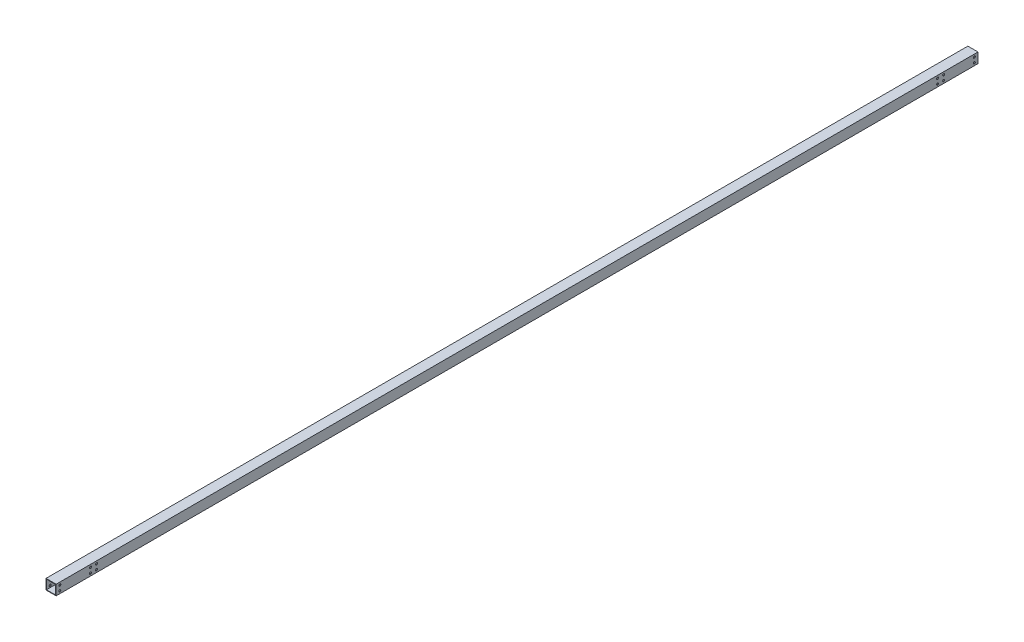
ISO-10303-21;
HEADER;
FILE_DESCRIPTION(('STEP AP214'),'2;1');
FILE_NAME('part.step','',(''),(''),'','','');
FILE_SCHEMA(('AUTOMOTIVE_DESIGN { 1 0 10303 214 1 1 1 1 }'));
ENDSEC;
DATA;
#1=APPLICATION_CONTEXT('core data for automotive mechanical design processes');
#2=APPLICATION_PROTOCOL_DEFINITION('international standard','automotive_design',2000,#1);
#3=PRODUCT_CONTEXT('',#1,'mechanical');
#4=PRODUCT('Part','Part','',(#3));
#5=PRODUCT_RELATED_PRODUCT_CATEGORY('part','',(#4));
#6=PRODUCT_DEFINITION_FORMATION('','',#4);
#7=PRODUCT_DEFINITION_CONTEXT('part definition',#1,'design');
#8=PRODUCT_DEFINITION('design','',#6,#7);
#9=PRODUCT_DEFINITION_SHAPE('','',#8);
#10=(LENGTH_UNIT() NAMED_UNIT(*) SI_UNIT(.MILLI.,.METRE.));
#11=(NAMED_UNIT(*) PLANE_ANGLE_UNIT() SI_UNIT($,.RADIAN.));
#12=(NAMED_UNIT(*) SI_UNIT($,.STERADIAN.) SOLID_ANGLE_UNIT());
#13=UNCERTAINTY_MEASURE_WITH_UNIT(LENGTH_MEASURE(1.E-05),#10,'distance_accuracy_value','');
#14=(GEOMETRIC_REPRESENTATION_CONTEXT(3) GLOBAL_UNCERTAINTY_ASSIGNED_CONTEXT((#13)) GLOBAL_UNIT_ASSIGNED_CONTEXT((#10,
#11,#12)) REPRESENTATION_CONTEXT('',''));
#15=CARTESIAN_POINT('',(0.,0.,0.));
#16=DIRECTION('',(0.,0.,1.));
#17=DIRECTION('',(1.,0.,0.));
#18=AXIS2_PLACEMENT_3D('',#15,#16,#17);
#19=CARTESIAN_POINT('',(0.,0.,1820.));
#20=DIRECTION('',(0.,0.,-1.));
#21=DIRECTION('',(-1.,0.,0.));
#22=AXIS2_PLACEMENT_3D('',#19,#20,#21);
#23=PLANE('',#22);
#24=DIRECTION('',(0.,-1.,0.));
#25=VECTOR('',#24,1.);
#26=CARTESIAN_POINT('',(0.,0.,1820.));
#27=LINE('',#26,#25);
#28=CARTESIAN_POINT('',(0.,20.,1820.));
#29=VERTEX_POINT('',#28);
#30=CARTESIAN_POINT('',(0.,0.,1820.));
#31=VERTEX_POINT('',#30);
#32=EDGE_CURVE('E159',#29,#31,#27,.T.);
#33=ORIENTED_EDGE('',*,*,#32,.T.);
#34=DIRECTION('',(1.,0.,0.));
#35=VECTOR('',#34,1.);
#36=CARTESIAN_POINT('',(0.,0.,1820.));
#37=LINE('',#36,#35);
#38=CARTESIAN_POINT('',(20.,0.,1820.));
#39=VERTEX_POINT('',#38);
#40=EDGE_CURVE('E163',#31,#39,#37,.T.);
#41=ORIENTED_EDGE('',*,*,#40,.T.);
#42=DIRECTION('',(0.,1.,0.));
#43=VECTOR('',#42,1.);
#44=CARTESIAN_POINT('',(20.,0.,1820.));
#45=LINE('',#44,#43);
#46=CARTESIAN_POINT('',(20.,20.,1820.));
#47=VERTEX_POINT('',#46);
#48=EDGE_CURVE('E167',#39,#47,#45,.T.);
#49=ORIENTED_EDGE('',*,*,#48,.T.);
#50=DIRECTION('',(-1.,0.,0.));
#51=VECTOR('',#50,1.);
#52=CARTESIAN_POINT('',(0.,20.,1820.));
#53=LINE('',#52,#51);
#54=EDGE_CURVE('E170',#47,#29,#53,.T.);
#55=ORIENTED_EDGE('',*,*,#54,.T.);
#56=EDGE_LOOP('',(#33,#41,#49,#55));
#57=FACE_BOUND('',#56,.T.);
#58=DIRECTION('',(0.,-1.,0.));
#59=VECTOR('',#58,1.);
#60=CARTESIAN_POINT('',(1.,1.,1820.));
#61=LINE('',#60,#59);
#62=CARTESIAN_POINT('',(1.,19.,1820.));
#63=VERTEX_POINT('',#62);
#64=CARTESIAN_POINT('',(1.,1.,1820.));
#65=VERTEX_POINT('',#64);
#66=EDGE_CURVE('E107',#63,#65,#61,.T.);
#67=ORIENTED_EDGE('',*,*,#66,.F.);
#68=DIRECTION('',(-1.,0.,0.));
#69=VECTOR('',#68,1.);
#70=CARTESIAN_POINT('',(1.,19.,1820.));
#71=LINE('',#70,#69);
#72=CARTESIAN_POINT('',(19.,19.,1820.));
#73=VERTEX_POINT('',#72);
#74=EDGE_CURVE('E135',#73,#63,#71,.T.);
#75=ORIENTED_EDGE('',*,*,#74,.F.);
#76=DIRECTION('',(0.,1.,0.));
#77=VECTOR('',#76,1.);
#78=CARTESIAN_POINT('',(19.,1.,1820.));
#79=LINE('',#78,#77);
#80=CARTESIAN_POINT('',(19.,1.,1820.));
#81=VERTEX_POINT('',#80);
#82=EDGE_CURVE('E129',#81,#73,#79,.T.);
#83=ORIENTED_EDGE('',*,*,#82,.F.);
#84=DIRECTION('',(1.,0.,0.));
#85=VECTOR('',#84,1.);
#86=CARTESIAN_POINT('',(1.,1.,1820.));
#87=LINE('',#86,#85);
#88=EDGE_CURVE('E116',#65,#81,#87,.T.);
#89=ORIENTED_EDGE('',*,*,#88,.F.);
#90=EDGE_LOOP('',(#67,#75,#83,#89));
#91=FACE_BOUND('',#90,.T.);
#92=ADVANCED_FACE('F39',(#57,#91),#23,.F.);
#93=CARTESIAN_POINT('',(0.,0.,0.));
#94=DIRECTION('',(0.,0.,-1.));
#95=DIRECTION('',(-1.,0.,0.));
#96=AXIS2_PLACEMENT_3D('',#93,#94,#95);
#97=PLANE('',#96);
#98=DIRECTION('',(0.,-1.,0.));
#99=VECTOR('',#98,1.);
#100=CARTESIAN_POINT('',(0.,0.,0.));
#101=LINE('',#100,#99);
#102=CARTESIAN_POINT('',(0.,20.,0.));
#103=VERTEX_POINT('',#102);
#104=CARTESIAN_POINT('',(0.,0.,0.));
#105=VERTEX_POINT('',#104);
#106=EDGE_CURVE('E125',#103,#105,#101,.T.);
#107=ORIENTED_EDGE('',*,*,#106,.F.);
#108=DIRECTION('',(-1.,0.,0.));
#109=VECTOR('',#108,1.);
#110=CARTESIAN_POINT('',(0.,20.,0.));
#111=LINE('',#110,#109);
#112=CARTESIAN_POINT('',(20.,20.,0.));
#113=VERTEX_POINT('',#112);
#114=EDGE_CURVE('E164',#113,#103,#111,.T.);
#115=ORIENTED_EDGE('',*,*,#114,.F.);
#116=DIRECTION('',(0.,1.,0.));
#117=VECTOR('',#116,1.);
#118=CARTESIAN_POINT('',(20.,0.,0.));
#119=LINE('',#118,#117);
#120=CARTESIAN_POINT('',(20.,0.,0.));
#121=VERTEX_POINT('',#120);
#122=EDGE_CURVE('E180',#121,#113,#119,.T.);
#123=ORIENTED_EDGE('',*,*,#122,.F.);
#124=DIRECTION('',(1.,0.,0.));
#125=VECTOR('',#124,1.);
#126=CARTESIAN_POINT('',(0.,0.,0.));
#127=LINE('',#126,#125);
#128=EDGE_CURVE('E177',#105,#121,#127,.T.);
#129=ORIENTED_EDGE('',*,*,#128,.F.);
#130=EDGE_LOOP('',(#107,#115,#123,#129));
#131=FACE_BOUND('',#130,.T.);
#132=DIRECTION('',(-1.,0.,0.));
#133=VECTOR('',#132,1.);
#134=CARTESIAN_POINT('',(1.,19.,0.));
#135=LINE('',#134,#133);
#136=CARTESIAN_POINT('',(19.,19.,0.));
#137=VERTEX_POINT('',#136);
#138=CARTESIAN_POINT('',(1.,19.,0.));
#139=VERTEX_POINT('',#138);
#140=EDGE_CURVE('E117',#137,#139,#135,.T.);
#141=ORIENTED_EDGE('',*,*,#140,.T.);
#142=DIRECTION('',(0.,-1.,0.));
#143=VECTOR('',#142,1.);
#144=CARTESIAN_POINT('',(1.,1.,0.));
#145=LINE('',#144,#143);
#146=CARTESIAN_POINT('',(1.,1.,0.));
#147=VERTEX_POINT('',#146);
#148=EDGE_CURVE('E65',#139,#147,#145,.T.);
#149=ORIENTED_EDGE('',*,*,#148,.T.);
#150=DIRECTION('',(1.,0.,0.));
#151=VECTOR('',#150,1.);
#152=CARTESIAN_POINT('',(1.,1.,0.));
#153=LINE('',#152,#151);
#154=CARTESIAN_POINT('',(19.,1.,0.));
#155=VERTEX_POINT('',#154);
#156=EDGE_CURVE('E123',#147,#155,#153,.T.);
#157=ORIENTED_EDGE('',*,*,#156,.T.);
#158=DIRECTION('',(0.,1.,0.));
#159=VECTOR('',#158,1.);
#160=CARTESIAN_POINT('',(19.,1.,0.));
#161=LINE('',#160,#159);
#162=EDGE_CURVE('E146',#155,#137,#161,.T.);
#163=ORIENTED_EDGE('',*,*,#162,.T.);
#164=EDGE_LOOP('',(#141,#149,#157,#163));
#165=FACE_BOUND('',#164,.T.);
#166=ADVANCED_FACE('F303',(#131,#165),#97,.T.);
#167=CARTESIAN_POINT('',(0.,0.,1820.));
#168=DIRECTION('',(1.,0.,0.));
#169=DIRECTION('',(0.,0.,-1.));
#170=AXIS2_PLACEMENT_3D('',#167,#168,#169);
#171=PLANE('',#170);
#172=CARTESIAN_POINT('',(0.,15.0000000000001,67.7999999999639));
#173=DIRECTION('',(-1.,0.,0.));
#174=DIRECTION('',(0.,0.,1.));
#175=AXIS2_PLACEMENT_3D('',#172,#173,#174);
#176=CIRCLE('',#175,2.);
#177=CARTESIAN_POINT('',(0.,15.0000000000001,69.7999999999639));
#178=VERTEX_POINT('',#177);
#179=EDGE_CURVE('E356',#178,#178,#176,.T.);
#180=ORIENTED_EDGE('',*,*,#179,.F.);
#181=EDGE_LOOP('',(#180));
#182=FACE_BOUND('',#181,.T.);
#183=CARTESIAN_POINT('',(0.,15.,7.19999999996389));
#184=DIRECTION('',(-1.,0.,0.));
#185=DIRECTION('',(0.,0.,1.));
#186=AXIS2_PLACEMENT_3D('',#183,#184,#185);
#187=CIRCLE('',#186,2.00000000000001);
#188=CARTESIAN_POINT('',(0.,15.,9.19999999996389));
#189=VERTEX_POINT('',#188);
#190=EDGE_CURVE('E360',#189,#189,#187,.T.);
#191=ORIENTED_EDGE('',*,*,#190,.F.);
#192=EDGE_LOOP('',(#191));
#193=FACE_BOUND('',#192,.T.);
#194=CARTESIAN_POINT('',(0.,5.00000000000003,7.19999999996389));
#195=DIRECTION('',(-1.,0.,0.));
#196=DIRECTION('',(0.,0.,1.));
#197=AXIS2_PLACEMENT_3D('',#194,#195,#196);
#198=CIRCLE('',#197,2.);
#199=CARTESIAN_POINT('',(0.,5.00000000000003,9.1999999999639));
#200=VERTEX_POINT('',#199);
#201=EDGE_CURVE('E364',#200,#200,#198,.T.);
#202=ORIENTED_EDGE('',*,*,#201,.F.);
#203=EDGE_LOOP('',(#202));
#204=FACE_BOUND('',#203,.T.);
#205=CARTESIAN_POINT('',(0.,5.00000000000003,1752.19999999996));
#206=DIRECTION('',(-1.,0.,0.));
#207=DIRECTION('',(0.,0.,1.));
#208=AXIS2_PLACEMENT_3D('',#205,#206,#207);
#209=CIRCLE('',#208,2.0000000000001);
#210=CARTESIAN_POINT('',(0.,5.00000000000003,1754.19999999996));
#211=VERTEX_POINT('',#210);
#212=EDGE_CURVE('E368',#211,#211,#209,.T.);
#213=ORIENTED_EDGE('',*,*,#212,.F.);
#214=EDGE_LOOP('',(#213));
#215=FACE_BOUND('',#214,.T.);
#216=CARTESIAN_POINT('',(0.,5.00000000000004,1740.19999999996));
#217=DIRECTION('',(-1.,0.,0.));
#218=DIRECTION('',(0.,0.,1.));
#219=AXIS2_PLACEMENT_3D('',#216,#217,#218);
#220=CIRCLE('',#219,2.0000000000001);
#221=CARTESIAN_POINT('',(0.,5.00000000000004,1742.19999999996));
#222=VERTEX_POINT('',#221);
#223=EDGE_CURVE('E372',#222,#222,#220,.T.);
#224=ORIENTED_EDGE('',*,*,#223,.F.);
#225=EDGE_LOOP('',(#224));
#226=FACE_BOUND('',#225,.T.);
#227=CARTESIAN_POINT('',(0.,15.,1740.19999999996));
#228=DIRECTION('',(-1.,0.,0.));
#229=DIRECTION('',(0.,0.,1.));
#230=AXIS2_PLACEMENT_3D('',#227,#228,#229);
#231=CIRCLE('',#230,2.0000000000001);
#232=CARTESIAN_POINT('',(0.,15.,1742.19999999996));
#233=VERTEX_POINT('',#232);
#234=EDGE_CURVE('E376',#233,#233,#231,.T.);
#235=ORIENTED_EDGE('',*,*,#234,.F.);
#236=EDGE_LOOP('',(#235));
#237=FACE_BOUND('',#236,.T.);
#238=CARTESIAN_POINT('',(0.,15.,1752.19999999996));
#239=DIRECTION('',(-1.,0.,0.));
#240=DIRECTION('',(0.,0.,1.));
#241=AXIS2_PLACEMENT_3D('',#238,#239,#240);
#242=CIRCLE('',#241,2.0000000000001);
#243=CARTESIAN_POINT('',(0.,15.,1754.19999999996));
#244=VERTEX_POINT('',#243);
#245=EDGE_CURVE('E380',#244,#244,#242,.T.);
#246=ORIENTED_EDGE('',*,*,#245,.F.);
#247=EDGE_LOOP('',(#246));
#248=FACE_BOUND('',#247,.T.);
#249=CARTESIAN_POINT('',(0.,15.0000000000001,1812.79999999996));
#250=DIRECTION('',(-1.,0.,0.));
#251=DIRECTION('',(0.,0.,1.));
#252=AXIS2_PLACEMENT_3D('',#249,#250,#251);
#253=CIRCLE('',#252,2.0000000000001);
#254=CARTESIAN_POINT('',(0.,15.0000000000001,1814.79999999996));
#255=VERTEX_POINT('',#254);
#256=EDGE_CURVE('E384',#255,#255,#253,.T.);
#257=ORIENTED_EDGE('',*,*,#256,.F.);
#258=EDGE_LOOP('',(#257));
#259=FACE_BOUND('',#258,.T.);
#260=CARTESIAN_POINT('',(0.,15.0000000000001,79.7999999999639));
#261=DIRECTION('',(-1.,0.,0.));
#262=DIRECTION('',(0.,0.,1.));
#263=AXIS2_PLACEMENT_3D('',#260,#261,#262);
#264=CIRCLE('',#263,2.);
#265=CARTESIAN_POINT('',(0.,15.0000000000001,81.7999999999639));
#266=VERTEX_POINT('',#265);
#267=EDGE_CURVE('E388',#266,#266,#264,.T.);
#268=ORIENTED_EDGE('',*,*,#267,.F.);
#269=EDGE_LOOP('',(#268));
#270=FACE_BOUND('',#269,.T.);
#271=CARTESIAN_POINT('',(0.,5.00000000000005,79.7999999999639));
#272=DIRECTION('',(-1.,0.,0.));
#273=DIRECTION('',(0.,0.,1.));
#274=AXIS2_PLACEMENT_3D('',#271,#272,#273);
#275=CIRCLE('',#274,2.);
#276=CARTESIAN_POINT('',(0.,5.00000000000005,81.7999999999639));
#277=VERTEX_POINT('',#276);
#278=EDGE_CURVE('E392',#277,#277,#275,.T.);
#279=ORIENTED_EDGE('',*,*,#278,.F.);
#280=EDGE_LOOP('',(#279));
#281=FACE_BOUND('',#280,.T.);
#282=CARTESIAN_POINT('',(0.,5.00000000000005,67.7999999999639));
#283=DIRECTION('',(-1.,0.,0.));
#284=DIRECTION('',(0.,0.,1.));
#285=AXIS2_PLACEMENT_3D('',#282,#283,#284);
#286=CIRCLE('',#285,2.);
#287=CARTESIAN_POINT('',(0.,5.00000000000005,69.7999999999639));
#288=VERTEX_POINT('',#287);
#289=EDGE_CURVE('E396',#288,#288,#286,.T.);
#290=ORIENTED_EDGE('',*,*,#289,.F.);
#291=EDGE_LOOP('',(#290));
#292=FACE_BOUND('',#291,.T.);
#293=CARTESIAN_POINT('',(0.,5.00000000000007,1812.79999999996));
#294=DIRECTION('',(-1.,0.,0.));
#295=DIRECTION('',(0.,0.,1.));
#296=AXIS2_PLACEMENT_3D('',#293,#294,#295);
#297=CIRCLE('',#296,2.0000000000001);
#298=CARTESIAN_POINT('',(0.,5.00000000000007,1814.79999999996));
#299=VERTEX_POINT('',#298);
#300=EDGE_CURVE('E399',#299,#299,#297,.T.);
#301=ORIENTED_EDGE('',*,*,#300,.F.);
#302=EDGE_LOOP('',(#301));
#303=FACE_BOUND('',#302,.T.);
#304=ORIENTED_EDGE('',*,*,#106,.T.);
#305=DIRECTION('',(0.,0.,-1.));
#306=VECTOR('',#305,1.);
#307=CARTESIAN_POINT('',(0.,0.,1820.));
#308=LINE('',#307,#306);
#309=EDGE_CURVE('E11',#31,#105,#308,.T.);
#310=ORIENTED_EDGE('',*,*,#309,.F.);
#311=ORIENTED_EDGE('',*,*,#32,.F.);
#312=DIRECTION('',(0.,0.,-1.));
#313=VECTOR('',#312,1.);
#314=CARTESIAN_POINT('',(0.,20.,1820.));
#315=LINE('',#314,#313);
#316=EDGE_CURVE('E173',#29,#103,#315,.T.);
#317=ORIENTED_EDGE('',*,*,#316,.T.);
#318=EDGE_LOOP('',(#304,#310,#311,#317));
#319=FACE_BOUND('',#318,.T.);
#320=ADVANCED_FACE('F41',(#182,#193,#204,#215,#226,#237,#248,#259,#270,#281,#292,#303,#319),
#171,.F.);
#321=CARTESIAN_POINT('',(0.,0.,1820.));
#322=DIRECTION('',(0.,1.,0.));
#323=DIRECTION('',(0.,0.,1.));
#324=AXIS2_PLACEMENT_3D('',#321,#322,#323);
#325=PLANE('',#324);
#326=ORIENTED_EDGE('',*,*,#128,.T.);
#327=DIRECTION('',(0.,0.,-1.));
#328=VECTOR('',#327,1.);
#329=CARTESIAN_POINT('',(20.,0.,1820.));
#330=LINE('',#329,#328);
#331=EDGE_CURVE('E49',#39,#121,#330,.T.);
#332=ORIENTED_EDGE('',*,*,#331,.F.);
#333=ORIENTED_EDGE('',*,*,#40,.F.);
#334=ORIENTED_EDGE('',*,*,#309,.T.);
#335=EDGE_LOOP('',(#326,#332,#333,#334));
#336=FACE_BOUND('',#335,.T.);
#337=ADVANCED_FACE('F331',(#336),#325,.F.);
#338=CARTESIAN_POINT('',(20.,0.,1820.));
#339=DIRECTION('',(-1.,0.,0.));
#340=DIRECTION('',(0.,0.,1.));
#341=AXIS2_PLACEMENT_3D('',#338,#339,#340);
#342=PLANE('',#341);
#343=CARTESIAN_POINT('',(20.,15.0000000000001,67.7999999999639));
#344=DIRECTION('',(-1.,0.,0.));
#345=DIRECTION('',(0.,0.,1.));
#346=AXIS2_PLACEMENT_3D('',#343,#344,#345);
#347=CIRCLE('',#346,2.);
#348=CARTESIAN_POINT('',(20.,15.0000000000001,69.7999999999639));
#349=VERTEX_POINT('',#348);
#350=EDGE_CURVE('E558',#349,#349,#347,.T.);
#351=ORIENTED_EDGE('',*,*,#350,.T.);
#352=EDGE_LOOP('',(#351));
#353=FACE_BOUND('',#352,.T.);
#354=CARTESIAN_POINT('',(20.,15.,7.19999999996389));
#355=DIRECTION('',(-1.,0.,0.));
#356=DIRECTION('',(0.,0.,1.));
#357=AXIS2_PLACEMENT_3D('',#354,#355,#356);
#358=CIRCLE('',#357,2.00000000000001);
#359=CARTESIAN_POINT('',(20.,15.,9.19999999996389));
#360=VERTEX_POINT('',#359);
#361=EDGE_CURVE('E553',#360,#360,#358,.T.);
#362=ORIENTED_EDGE('',*,*,#361,.T.);
#363=EDGE_LOOP('',(#362));
#364=FACE_BOUND('',#363,.T.);
#365=CARTESIAN_POINT('',(20.,5.00000000000003,7.19999999996389));
#366=DIRECTION('',(-1.,0.,0.));
#367=DIRECTION('',(0.,0.,1.));
#368=AXIS2_PLACEMENT_3D('',#365,#366,#367);
#369=CIRCLE('',#368,2.);
#370=CARTESIAN_POINT('',(20.,5.00000000000003,9.1999999999639));
#371=VERTEX_POINT('',#370);
#372=EDGE_CURVE('E548',#371,#371,#369,.T.);
#373=ORIENTED_EDGE('',*,*,#372,.T.);
#374=EDGE_LOOP('',(#373));
#375=FACE_BOUND('',#374,.T.);
#376=CARTESIAN_POINT('',(20.,5.00000000000003,1752.19999999996));
#377=DIRECTION('',(-1.,0.,0.));
#378=DIRECTION('',(0.,0.,1.));
#379=AXIS2_PLACEMENT_3D('',#376,#377,#378);
#380=CIRCLE('',#379,2.0000000000001);
#381=CARTESIAN_POINT('',(20.,5.00000000000003,1754.19999999996));
#382=VERTEX_POINT('',#381);
#383=EDGE_CURVE('E542',#382,#382,#380,.T.);
#384=ORIENTED_EDGE('',*,*,#383,.T.);
#385=EDGE_LOOP('',(#384));
#386=FACE_BOUND('',#385,.T.);
#387=CARTESIAN_POINT('',(20.,5.00000000000004,1740.19999999996));
#388=DIRECTION('',(-1.,0.,0.));
#389=DIRECTION('',(0.,0.,1.));
#390=AXIS2_PLACEMENT_3D('',#387,#388,#389);
#391=CIRCLE('',#390,2.0000000000001);
#392=CARTESIAN_POINT('',(20.,5.00000000000004,1742.19999999996));
#393=VERTEX_POINT('',#392);
#394=EDGE_CURVE('E576',#393,#393,#391,.T.);
#395=ORIENTED_EDGE('',*,*,#394,.T.);
#396=EDGE_LOOP('',(#395));
#397=FACE_BOUND('',#396,.T.);
#398=CARTESIAN_POINT('',(20.,15.,1740.19999999996));
#399=DIRECTION('',(-1.,0.,0.));
#400=DIRECTION('',(0.,0.,1.));
#401=AXIS2_PLACEMENT_3D('',#398,#399,#400);
#402=CIRCLE('',#401,2.0000000000001);
#403=CARTESIAN_POINT('',(20.,15.,1742.19999999996));
#404=VERTEX_POINT('',#403);
#405=EDGE_CURVE('E572',#404,#404,#402,.T.);
#406=ORIENTED_EDGE('',*,*,#405,.T.);
#407=EDGE_LOOP('',(#406));
#408=FACE_BOUND('',#407,.T.);
#409=CARTESIAN_POINT('',(20.,15.,1752.19999999996));
#410=DIRECTION('',(-1.,0.,0.));
#411=DIRECTION('',(0.,0.,1.));
#412=AXIS2_PLACEMENT_3D('',#409,#410,#411);
#413=CIRCLE('',#412,2.0000000000001);
#414=CARTESIAN_POINT('',(20.,15.,1754.19999999996));
#415=VERTEX_POINT('',#414);
#416=EDGE_CURVE('E566',#415,#415,#413,.T.);
#417=ORIENTED_EDGE('',*,*,#416,.T.);
#418=EDGE_LOOP('',(#417));
#419=FACE_BOUND('',#418,.T.);
#420=CARTESIAN_POINT('',(20.,15.0000000000001,1812.79999999996));
#421=DIRECTION('',(-1.,0.,0.));
#422=DIRECTION('',(0.,0.,1.));
#423=AXIS2_PLACEMENT_3D('',#420,#421,#422);
#424=CIRCLE('',#423,2.0000000000001);
#425=CARTESIAN_POINT('',(20.,15.0000000000001,1814.79999999996));
#426=VERTEX_POINT('',#425);
#427=EDGE_CURVE('E402',#426,#426,#424,.T.);
#428=ORIENTED_EDGE('',*,*,#427,.T.);
#429=EDGE_LOOP('',(#428));
#430=FACE_BOUND('',#429,.T.);
#431=CARTESIAN_POINT('',(20.,15.0000000000001,79.7999999999639));
#432=DIRECTION('',(-1.,0.,0.));
#433=DIRECTION('',(0.,0.,1.));
#434=AXIS2_PLACEMENT_3D('',#431,#432,#433);
#435=CIRCLE('',#434,2.);
#436=CARTESIAN_POINT('',(20.,15.0000000000001,81.7999999999639));
#437=VERTEX_POINT('',#436);
#438=EDGE_CURVE('E524',#437,#437,#435,.T.);
#439=ORIENTED_EDGE('',*,*,#438,.T.);
#440=EDGE_LOOP('',(#439));
#441=FACE_BOUND('',#440,.T.);
#442=CARTESIAN_POINT('',(20.,5.00000000000005,79.7999999999639));
#443=DIRECTION('',(-1.,0.,0.));
#444=DIRECTION('',(0.,0.,1.));
#445=AXIS2_PLACEMENT_3D('',#442,#443,#444);
#446=CIRCLE('',#445,2.);
#447=CARTESIAN_POINT('',(20.,5.00000000000005,81.7999999999639));
#448=VERTEX_POINT('',#447);
#449=EDGE_CURVE('E525',#448,#448,#446,.T.);
#450=ORIENTED_EDGE('',*,*,#449,.T.);
#451=EDGE_LOOP('',(#450));
#452=FACE_BOUND('',#451,.T.);
#453=CARTESIAN_POINT('',(20.,5.00000000000005,67.7999999999639));
#454=DIRECTION('',(-1.,0.,0.));
#455=DIRECTION('',(0.,0.,1.));
#456=AXIS2_PLACEMENT_3D('',#453,#454,#455);
#457=CIRCLE('',#456,2.);
#458=CARTESIAN_POINT('',(20.,5.00000000000005,69.7999999999639));
#459=VERTEX_POINT('',#458);
#460=EDGE_CURVE('E537',#459,#459,#457,.T.);
#461=ORIENTED_EDGE('',*,*,#460,.T.);
#462=EDGE_LOOP('',(#461));
#463=FACE_BOUND('',#462,.T.);
#464=CARTESIAN_POINT('',(20.,5.00000000000007,1812.79999999996));
#465=DIRECTION('',(-1.,0.,0.));
#466=DIRECTION('',(0.,0.,1.));
#467=AXIS2_PLACEMENT_3D('',#464,#465,#466);
#468=CIRCLE('',#467,2.0000000000001);
#469=CARTESIAN_POINT('',(20.,5.00000000000007,1814.79999999996));
#470=VERTEX_POINT('',#469);
#471=EDGE_CURVE('E200',#470,#470,#468,.T.);
#472=ORIENTED_EDGE('',*,*,#471,.T.);
#473=EDGE_LOOP('',(#472));
#474=FACE_BOUND('',#473,.T.);
#475=ORIENTED_EDGE('',*,*,#122,.T.);
#476=DIRECTION('',(0.,0.,-1.));
#477=VECTOR('',#476,1.);
#478=CARTESIAN_POINT('',(20.,20.,1820.));
#479=LINE('',#478,#477);
#480=EDGE_CURVE('E188',#47,#113,#479,.T.);
#481=ORIENTED_EDGE('',*,*,#480,.F.);
#482=ORIENTED_EDGE('',*,*,#48,.F.);
#483=ORIENTED_EDGE('',*,*,#331,.T.);
#484=EDGE_LOOP('',(#475,#481,#482,#483));
#485=FACE_BOUND('',#484,.T.);
#486=ADVANCED_FACE('F328',(#353,#364,#375,#386,#397,#408,#419,#430,#441,#452,#463,#474,#485),
#342,.F.);
#487=CARTESIAN_POINT('',(0.,20.,1820.));
#488=DIRECTION('',(0.,-1.,0.));
#489=DIRECTION('',(0.,0.,-1.));
#490=AXIS2_PLACEMENT_3D('',#487,#488,#489);
#491=PLANE('',#490);
#492=ORIENTED_EDGE('',*,*,#114,.T.);
#493=ORIENTED_EDGE('',*,*,#316,.F.);
#494=ORIENTED_EDGE('',*,*,#54,.F.);
#495=ORIENTED_EDGE('',*,*,#480,.T.);
#496=EDGE_LOOP('',(#492,#493,#494,#495));
#497=FACE_BOUND('',#496,.T.);
#498=ADVANCED_FACE('F325',(#497),#491,.F.);
#499=CARTESIAN_POINT('',(1.,1.,1820.));
#500=DIRECTION('',(1.,0.,0.));
#501=DIRECTION('',(0.,0.,-1.));
#502=AXIS2_PLACEMENT_3D('',#499,#500,#501);
#503=PLANE('',#502);
#504=CARTESIAN_POINT('',(1.,15.0000000000001,67.7999999999639));
#505=DIRECTION('',(1.,0.,0.));
#506=DIRECTION('',(0.,0.,-1.));
#507=AXIS2_PLACEMENT_3D('',#504,#505,#506);
#508=CIRCLE('',#507,2.);
#509=CARTESIAN_POINT('',(1.,15.0000000000001,65.7999999999639));
#510=VERTEX_POINT('',#509);
#511=EDGE_CURVE('E143',#510,#510,#508,.T.);
#512=ORIENTED_EDGE('',*,*,#511,.F.);
#513=EDGE_LOOP('',(#512));
#514=FACE_BOUND('',#513,.T.);
#515=CARTESIAN_POINT('',(1.,15.,7.19999999996389));
#516=DIRECTION('',(1.,0.,0.));
#517=DIRECTION('',(0.,0.,-1.));
#518=AXIS2_PLACEMENT_3D('',#515,#516,#517);
#519=CIRCLE('',#518,2.00000000000001);
#520=CARTESIAN_POINT('',(1.,15.,5.19999999996388));
#521=VERTEX_POINT('',#520);
#522=EDGE_CURVE('E247',#521,#521,#519,.T.);
#523=ORIENTED_EDGE('',*,*,#522,.F.);
#524=EDGE_LOOP('',(#523));
#525=FACE_BOUND('',#524,.T.);
#526=CARTESIAN_POINT('',(1.,5.00000000000003,7.19999999996389));
#527=DIRECTION('',(1.,0.,0.));
#528=DIRECTION('',(0.,0.,-1.));
#529=AXIS2_PLACEMENT_3D('',#526,#527,#528);
#530=CIRCLE('',#529,2.);
#531=CARTESIAN_POINT('',(1.,5.00000000000003,5.19999999996389));
#532=VERTEX_POINT('',#531);
#533=EDGE_CURVE('E243',#532,#532,#530,.T.);
#534=ORIENTED_EDGE('',*,*,#533,.F.);
#535=EDGE_LOOP('',(#534));
#536=FACE_BOUND('',#535,.T.);
#537=CARTESIAN_POINT('',(1.,5.00000000000003,1752.19999999996));
#538=DIRECTION('',(1.,0.,0.));
#539=DIRECTION('',(0.,0.,-1.));
#540=AXIS2_PLACEMENT_3D('',#537,#538,#539);
#541=CIRCLE('',#540,2.0000000000001);
#542=CARTESIAN_POINT('',(1.,5.00000000000003,1750.19999999996));
#543=VERTEX_POINT('',#542);
#544=EDGE_CURVE('E239',#543,#543,#541,.T.);
#545=ORIENTED_EDGE('',*,*,#544,.F.);
#546=EDGE_LOOP('',(#545));
#547=FACE_BOUND('',#546,.T.);
#548=CARTESIAN_POINT('',(1.,5.00000000000004,1740.19999999996));
#549=DIRECTION('',(1.,0.,0.));
#550=DIRECTION('',(0.,0.,-1.));
#551=AXIS2_PLACEMENT_3D('',#548,#549,#550);
#552=CIRCLE('',#551,2.0000000000001);
#553=CARTESIAN_POINT('',(1.,5.00000000000004,1738.19999999996));
#554=VERTEX_POINT('',#553);
#555=EDGE_CURVE('E234',#554,#554,#552,.T.);
#556=ORIENTED_EDGE('',*,*,#555,.F.);
#557=EDGE_LOOP('',(#556));
#558=FACE_BOUND('',#557,.T.);
#559=CARTESIAN_POINT('',(1.,15.,1740.19999999996));
#560=DIRECTION('',(1.,0.,0.));
#561=DIRECTION('',(0.,0.,-1.));
#562=AXIS2_PLACEMENT_3D('',#559,#560,#561);
#563=CIRCLE('',#562,2.0000000000001);
#564=CARTESIAN_POINT('',(1.,15.,1738.19999999996));
#565=VERTEX_POINT('',#564);
#566=EDGE_CURVE('E229',#565,#565,#563,.T.);
#567=ORIENTED_EDGE('',*,*,#566,.F.);
#568=EDGE_LOOP('',(#567));
#569=FACE_BOUND('',#568,.T.);
#570=CARTESIAN_POINT('',(1.,15.,1752.19999999996));
#571=DIRECTION('',(1.,0.,0.));
#572=DIRECTION('',(0.,0.,-1.));
#573=AXIS2_PLACEMENT_3D('',#570,#571,#572);
#574=CIRCLE('',#573,2.0000000000001);
#575=CARTESIAN_POINT('',(1.,15.,1750.19999999996));
#576=VERTEX_POINT('',#575);
#577=EDGE_CURVE('E224',#576,#576,#574,.T.);
#578=ORIENTED_EDGE('',*,*,#577,.F.);
#579=EDGE_LOOP('',(#578));
#580=FACE_BOUND('',#579,.T.);
#581=CARTESIAN_POINT('',(1.,15.0000000000001,1812.79999999996));
#582=DIRECTION('',(1.,0.,0.));
#583=DIRECTION('',(0.,0.,-1.));
#584=AXIS2_PLACEMENT_3D('',#581,#582,#583);
#585=CIRCLE('',#584,2.0000000000001);
#586=CARTESIAN_POINT('',(1.,15.0000000000001,1810.79999999996));
#587=VERTEX_POINT('',#586);
#588=EDGE_CURVE('E219',#587,#587,#585,.T.);
#589=ORIENTED_EDGE('',*,*,#588,.F.);
#590=EDGE_LOOP('',(#589));
#591=FACE_BOUND('',#590,.T.);
#592=CARTESIAN_POINT('',(1.,15.0000000000001,79.7999999999639));
#593=DIRECTION('',(1.,0.,0.));
#594=DIRECTION('',(0.,0.,-1.));
#595=AXIS2_PLACEMENT_3D('',#592,#593,#594);
#596=CIRCLE('',#595,2.);
#597=CARTESIAN_POINT('',(1.,15.0000000000001,77.7999999999639));
#598=VERTEX_POINT('',#597);
#599=EDGE_CURVE('E214',#598,#598,#596,.T.);
#600=ORIENTED_EDGE('',*,*,#599,.F.);
#601=EDGE_LOOP('',(#600));
#602=FACE_BOUND('',#601,.T.);
#603=CARTESIAN_POINT('',(1.,5.00000000000005,79.7999999999639));
#604=DIRECTION('',(1.,0.,0.));
#605=DIRECTION('',(0.,0.,-1.));
#606=AXIS2_PLACEMENT_3D('',#603,#604,#605);
#607=CIRCLE('',#606,2.);
#608=CARTESIAN_POINT('',(1.,5.00000000000005,77.7999999999639));
#609=VERTEX_POINT('',#608);
#610=EDGE_CURVE('E209',#609,#609,#607,.T.);
#611=ORIENTED_EDGE('',*,*,#610,.F.);
#612=EDGE_LOOP('',(#611));
#613=FACE_BOUND('',#612,.T.);
#614=CARTESIAN_POINT('',(1.,5.00000000000005,67.7999999999639));
#615=DIRECTION('',(1.,0.,0.));
#616=DIRECTION('',(0.,0.,-1.));
#617=AXIS2_PLACEMENT_3D('',#614,#615,#616);
#618=CIRCLE('',#617,2.);
#619=CARTESIAN_POINT('',(1.,5.00000000000005,65.7999999999639));
#620=VERTEX_POINT('',#619);
#621=EDGE_CURVE('E205',#620,#620,#618,.T.);
#622=ORIENTED_EDGE('',*,*,#621,.F.);
#623=EDGE_LOOP('',(#622));
#624=FACE_BOUND('',#623,.T.);
#625=CARTESIAN_POINT('',(1.,5.00000000000007,1812.79999999996));
#626=DIRECTION('',(1.,0.,0.));
#627=DIRECTION('',(0.,0.,-1.));
#628=AXIS2_PLACEMENT_3D('',#625,#626,#627);
#629=CIRCLE('',#628,2.0000000000001);
#630=CARTESIAN_POINT('',(1.,5.00000000000007,1810.79999999996));
#631=VERTEX_POINT('',#630);
#632=EDGE_CURVE('E199',#631,#631,#629,.T.);
#633=ORIENTED_EDGE('',*,*,#632,.F.);
#634=EDGE_LOOP('',(#633));
#635=FACE_BOUND('',#634,.T.);
#636=ORIENTED_EDGE('',*,*,#148,.F.);
#637=DIRECTION('',(0.,0.,-1.));
#638=VECTOR('',#637,1.);
#639=CARTESIAN_POINT('',(1.,19.,1820.));
#640=LINE('',#639,#638);
#641=EDGE_CURVE('E111',#63,#139,#640,.T.);
#642=ORIENTED_EDGE('',*,*,#641,.F.);
#643=ORIENTED_EDGE('',*,*,#66,.T.);
#644=DIRECTION('',(0.,0.,-1.));
#645=VECTOR('',#644,1.);
#646=CARTESIAN_POINT('',(1.,1.,1820.));
#647=LINE('',#646,#645);
#648=EDGE_CURVE('E110',#65,#147,#647,.T.);
#649=ORIENTED_EDGE('',*,*,#648,.T.);
#650=EDGE_LOOP('',(#636,#642,#643,#649));
#651=FACE_BOUND('',#650,.T.);
#652=ADVANCED_FACE('F109',(#514,#525,#536,#547,#558,#569,#580,#591,#602,#613,#624,#635,#651),
#503,.T.);
#653=CARTESIAN_POINT('',(1.,1.,1820.));
#654=DIRECTION('',(0.,1.,0.));
#655=DIRECTION('',(0.,0.,1.));
#656=AXIS2_PLACEMENT_3D('',#653,#654,#655);
#657=PLANE('',#656);
#658=ORIENTED_EDGE('',*,*,#156,.F.);
#659=ORIENTED_EDGE('',*,*,#648,.F.);
#660=ORIENTED_EDGE('',*,*,#88,.T.);
#661=DIRECTION('',(0.,0.,-1.));
#662=VECTOR('',#661,1.);
#663=CARTESIAN_POINT('',(19.,1.,1820.));
#664=LINE('',#663,#662);
#665=EDGE_CURVE('E126',#81,#155,#664,.T.);
#666=ORIENTED_EDGE('',*,*,#665,.T.);
#667=EDGE_LOOP('',(#658,#659,#660,#666));
#668=FACE_BOUND('',#667,.T.);
#669=ADVANCED_FACE('F120',(#668),#657,.T.);
#670=CARTESIAN_POINT('',(19.,1.,1820.));
#671=DIRECTION('',(-1.,0.,0.));
#672=DIRECTION('',(0.,0.,1.));
#673=AXIS2_PLACEMENT_3D('',#670,#671,#672);
#674=PLANE('',#673);
#675=CARTESIAN_POINT('',(19.,15.0000000000001,67.7999999999639));
#676=DIRECTION('',(-1.,0.,0.));
#677=DIRECTION('',(0.,0.,1.));
#678=AXIS2_PLACEMENT_3D('',#675,#676,#677);
#679=CIRCLE('',#678,2.);
#680=CARTESIAN_POINT('',(19.,15.0000000000001,69.7999999999639));
#681=VERTEX_POINT('',#680);
#682=EDGE_CURVE('E43',#681,#681,#679,.T.);
#683=ORIENTED_EDGE('',*,*,#682,.F.);
#684=EDGE_LOOP('',(#683));
#685=FACE_BOUND('',#684,.T.);
#686=CARTESIAN_POINT('',(19.,15.,7.19999999996389));
#687=DIRECTION('',(-1.,0.,0.));
#688=DIRECTION('',(0.,0.,1.));
#689=AXIS2_PLACEMENT_3D('',#686,#687,#688);
#690=CIRCLE('',#689,2.00000000000001);
#691=CARTESIAN_POINT('',(19.,15.,9.19999999996389));
#692=VERTEX_POINT('',#691);
#693=EDGE_CURVE('E244',#692,#692,#690,.T.);
#694=ORIENTED_EDGE('',*,*,#693,.F.);
#695=EDGE_LOOP('',(#694));
#696=FACE_BOUND('',#695,.T.);
#697=CARTESIAN_POINT('',(19.,5.00000000000003,7.19999999996389));
#698=DIRECTION('',(-1.,0.,0.));
#699=DIRECTION('',(0.,0.,1.));
#700=AXIS2_PLACEMENT_3D('',#697,#698,#699);
#701=CIRCLE('',#700,2.);
#702=CARTESIAN_POINT('',(19.,5.00000000000003,9.1999999999639));
#703=VERTEX_POINT('',#702);
#704=EDGE_CURVE('E240',#703,#703,#701,.T.);
#705=ORIENTED_EDGE('',*,*,#704,.F.);
#706=EDGE_LOOP('',(#705));
#707=FACE_BOUND('',#706,.T.);
#708=CARTESIAN_POINT('',(19.,5.00000000000003,1752.19999999996));
#709=DIRECTION('',(-1.,0.,0.));
#710=DIRECTION('',(0.,0.,1.));
#711=AXIS2_PLACEMENT_3D('',#708,#709,#710);
#712=CIRCLE('',#711,2.0000000000001);
#713=CARTESIAN_POINT('',(19.,5.00000000000003,1754.19999999996));
#714=VERTEX_POINT('',#713);
#715=EDGE_CURVE('E235',#714,#714,#712,.T.);
#716=ORIENTED_EDGE('',*,*,#715,.F.);
#717=EDGE_LOOP('',(#716));
#718=FACE_BOUND('',#717,.T.);
#719=CARTESIAN_POINT('',(19.,5.00000000000004,1740.19999999996));
#720=DIRECTION('',(-1.,0.,0.));
#721=DIRECTION('',(0.,0.,1.));
#722=AXIS2_PLACEMENT_3D('',#719,#720,#721);
#723=CIRCLE('',#722,2.0000000000001);
#724=CARTESIAN_POINT('',(19.,5.00000000000004,1742.19999999996));
#725=VERTEX_POINT('',#724);
#726=EDGE_CURVE('E230',#725,#725,#723,.T.);
#727=ORIENTED_EDGE('',*,*,#726,.F.);
#728=EDGE_LOOP('',(#727));
#729=FACE_BOUND('',#728,.T.);
#730=CARTESIAN_POINT('',(19.,15.,1740.19999999996));
#731=DIRECTION('',(-1.,0.,0.));
#732=DIRECTION('',(0.,0.,1.));
#733=AXIS2_PLACEMENT_3D('',#730,#731,#732);
#734=CIRCLE('',#733,2.0000000000001);
#735=CARTESIAN_POINT('',(19.,15.,1742.19999999996));
#736=VERTEX_POINT('',#735);
#737=EDGE_CURVE('E225',#736,#736,#734,.T.);
#738=ORIENTED_EDGE('',*,*,#737,.F.);
#739=EDGE_LOOP('',(#738));
#740=FACE_BOUND('',#739,.T.);
#741=CARTESIAN_POINT('',(19.,15.,1752.19999999996));
#742=DIRECTION('',(-1.,0.,0.));
#743=DIRECTION('',(0.,0.,1.));
#744=AXIS2_PLACEMENT_3D('',#741,#742,#743);
#745=CIRCLE('',#744,2.0000000000001);
#746=CARTESIAN_POINT('',(19.,15.,1754.19999999996));
#747=VERTEX_POINT('',#746);
#748=EDGE_CURVE('E220',#747,#747,#745,.T.);
#749=ORIENTED_EDGE('',*,*,#748,.F.);
#750=EDGE_LOOP('',(#749));
#751=FACE_BOUND('',#750,.T.);
#752=CARTESIAN_POINT('',(19.,15.0000000000001,1812.79999999996));
#753=DIRECTION('',(-1.,0.,0.));
#754=DIRECTION('',(0.,0.,1.));
#755=AXIS2_PLACEMENT_3D('',#752,#753,#754);
#756=CIRCLE('',#755,2.0000000000001);
#757=CARTESIAN_POINT('',(19.,15.0000000000001,1814.79999999996));
#758=VERTEX_POINT('',#757);
#759=EDGE_CURVE('E215',#758,#758,#756,.T.);
#760=ORIENTED_EDGE('',*,*,#759,.F.);
#761=EDGE_LOOP('',(#760));
#762=FACE_BOUND('',#761,.T.);
#763=CARTESIAN_POINT('',(19.,15.0000000000001,79.7999999999639));
#764=DIRECTION('',(-1.,0.,0.));
#765=DIRECTION('',(0.,0.,1.));
#766=AXIS2_PLACEMENT_3D('',#763,#764,#765);
#767=CIRCLE('',#766,2.);
#768=CARTESIAN_POINT('',(19.,15.0000000000001,81.7999999999639));
#769=VERTEX_POINT('',#768);
#770=EDGE_CURVE('E210',#769,#769,#767,.T.);
#771=ORIENTED_EDGE('',*,*,#770,.F.);
#772=EDGE_LOOP('',(#771));
#773=FACE_BOUND('',#772,.T.);
#774=CARTESIAN_POINT('',(19.,5.00000000000005,79.7999999999639));
#775=DIRECTION('',(-1.,0.,0.));
#776=DIRECTION('',(0.,0.,1.));
#777=AXIS2_PLACEMENT_3D('',#774,#775,#776);
#778=CIRCLE('',#777,2.);
#779=CARTESIAN_POINT('',(19.,5.00000000000005,81.7999999999639));
#780=VERTEX_POINT('',#779);
#781=EDGE_CURVE('E206',#780,#780,#778,.T.);
#782=ORIENTED_EDGE('',*,*,#781,.F.);
#783=EDGE_LOOP('',(#782));
#784=FACE_BOUND('',#783,.T.);
#785=CARTESIAN_POINT('',(19.,5.00000000000005,67.7999999999639));
#786=DIRECTION('',(-1.,0.,0.));
#787=DIRECTION('',(0.,0.,1.));
#788=AXIS2_PLACEMENT_3D('',#785,#786,#787);
#789=CIRCLE('',#788,2.);
#790=CARTESIAN_POINT('',(19.,5.00000000000005,69.7999999999639));
#791=VERTEX_POINT('',#790);
#792=EDGE_CURVE('E201',#791,#791,#789,.T.);
#793=ORIENTED_EDGE('',*,*,#792,.F.);
#794=EDGE_LOOP('',(#793));
#795=FACE_BOUND('',#794,.T.);
#796=CARTESIAN_POINT('',(19.,5.00000000000007,1812.79999999996));
#797=DIRECTION('',(-1.,0.,0.));
#798=DIRECTION('',(0.,0.,1.));
#799=AXIS2_PLACEMENT_3D('',#796,#797,#798);
#800=CIRCLE('',#799,2.0000000000001);
#801=CARTESIAN_POINT('',(19.,5.00000000000007,1814.79999999996));
#802=VERTEX_POINT('',#801);
#803=EDGE_CURVE('E195',#802,#802,#800,.T.);
#804=ORIENTED_EDGE('',*,*,#803,.F.);
#805=EDGE_LOOP('',(#804));
#806=FACE_BOUND('',#805,.T.);
#807=ORIENTED_EDGE('',*,*,#162,.F.);
#808=ORIENTED_EDGE('',*,*,#665,.F.);
#809=ORIENTED_EDGE('',*,*,#82,.T.);
#810=DIRECTION('',(0.,0.,-1.));
#811=VECTOR('',#810,1.);
#812=CARTESIAN_POINT('',(19.,19.,1820.));
#813=LINE('',#812,#811);
#814=EDGE_CURVE('E57',#73,#137,#813,.T.);
#815=ORIENTED_EDGE('',*,*,#814,.T.);
#816=EDGE_LOOP('',(#807,#808,#809,#815));
#817=FACE_BOUND('',#816,.T.);
#818=ADVANCED_FACE('F275',(#685,#696,#707,#718,#729,#740,#751,#762,#773,#784,#795,#806,#817),
#674,.T.);
#819=CARTESIAN_POINT('',(1.,19.,1820.));
#820=DIRECTION('',(0.,-1.,0.));
#821=DIRECTION('',(0.,0.,-1.));
#822=AXIS2_PLACEMENT_3D('',#819,#820,#821);
#823=PLANE('',#822);
#824=ORIENTED_EDGE('',*,*,#140,.F.);
#825=ORIENTED_EDGE('',*,*,#814,.F.);
#826=ORIENTED_EDGE('',*,*,#74,.T.);
#827=ORIENTED_EDGE('',*,*,#641,.T.);
#828=EDGE_LOOP('',(#824,#825,#826,#827));
#829=FACE_BOUND('',#828,.T.);
#830=ADVANCED_FACE('F278',(#829),#823,.T.);
#831=CARTESIAN_POINT('',(20.,5.00000000000007,1812.79999999996));
#832=DIRECTION('',(-1.,0.,0.));
#833=DIRECTION('',(0.,0.,1.));
#834=AXIS2_PLACEMENT_3D('',#831,#832,#833);
#835=CYLINDRICAL_SURFACE('',#834,2.0000000000001);
#836=ORIENTED_EDGE('',*,*,#803,.T.);
#837=EDGE_LOOP('',(#836));
#838=FACE_BOUND('',#837,.T.);
#839=ORIENTED_EDGE('',*,*,#471,.F.);
#840=EDGE_LOOP('',(#839));
#841=FACE_BOUND('',#840,.T.);
#842=ADVANCED_FACE('F305',(#838,#841),#835,.F.);
#843=CARTESIAN_POINT('',(20.,5.00000000000005,67.7999999999639));
#844=DIRECTION('',(-1.,0.,0.));
#845=DIRECTION('',(0.,0.,1.));
#846=AXIS2_PLACEMENT_3D('',#843,#844,#845);
#847=CYLINDRICAL_SURFACE('',#846,2.);
#848=ORIENTED_EDGE('',*,*,#792,.T.);
#849=EDGE_LOOP('',(#848));
#850=FACE_BOUND('',#849,.T.);
#851=ORIENTED_EDGE('',*,*,#460,.F.);
#852=EDGE_LOOP('',(#851));
#853=FACE_BOUND('',#852,.T.);
#854=ADVANCED_FACE('F310',(#850,#853),#847,.F.);
#855=CARTESIAN_POINT('',(20.,5.00000000000005,79.7999999999639));
#856=DIRECTION('',(-1.,0.,0.));
#857=DIRECTION('',(0.,0.,1.));
#858=AXIS2_PLACEMENT_3D('',#855,#856,#857);
#859=CYLINDRICAL_SURFACE('',#858,2.);
#860=ORIENTED_EDGE('',*,*,#781,.T.);
#861=EDGE_LOOP('',(#860));
#862=FACE_BOUND('',#861,.T.);
#863=ORIENTED_EDGE('',*,*,#449,.F.);
#864=EDGE_LOOP('',(#863));
#865=FACE_BOUND('',#864,.T.);
#866=ADVANCED_FACE('F503',(#862,#865),#859,.F.);
#867=CARTESIAN_POINT('',(20.,15.0000000000001,79.7999999999639));
#868=DIRECTION('',(-1.,0.,0.));
#869=DIRECTION('',(0.,0.,1.));
#870=AXIS2_PLACEMENT_3D('',#867,#868,#869);
#871=CYLINDRICAL_SURFACE('',#870,2.);
#872=ORIENTED_EDGE('',*,*,#770,.T.);
#873=EDGE_LOOP('',(#872));
#874=FACE_BOUND('',#873,.T.);
#875=ORIENTED_EDGE('',*,*,#438,.F.);
#876=EDGE_LOOP('',(#875));
#877=FACE_BOUND('',#876,.T.);
#878=ADVANCED_FACE('F486',(#874,#877),#871,.F.);
#879=CARTESIAN_POINT('',(20.,15.0000000000001,1812.79999999996));
#880=DIRECTION('',(-1.,0.,0.));
#881=DIRECTION('',(0.,0.,1.));
#882=AXIS2_PLACEMENT_3D('',#879,#880,#881);
#883=CYLINDRICAL_SURFACE('',#882,2.0000000000001);
#884=ORIENTED_EDGE('',*,*,#759,.T.);
#885=EDGE_LOOP('',(#884));
#886=FACE_BOUND('',#885,.T.);
#887=ORIENTED_EDGE('',*,*,#427,.F.);
#888=EDGE_LOOP('',(#887));
#889=FACE_BOUND('',#888,.T.);
#890=ADVANCED_FACE('F482',(#886,#889),#883,.F.);
#891=CARTESIAN_POINT('',(20.,15.,1752.19999999996));
#892=DIRECTION('',(-1.,0.,0.));
#893=DIRECTION('',(0.,0.,1.));
#894=AXIS2_PLACEMENT_3D('',#891,#892,#893);
#895=CYLINDRICAL_SURFACE('',#894,2.0000000000001);
#896=ORIENTED_EDGE('',*,*,#748,.T.);
#897=EDGE_LOOP('',(#896));
#898=FACE_BOUND('',#897,.T.);
#899=ORIENTED_EDGE('',*,*,#416,.F.);
#900=EDGE_LOOP('',(#899));
#901=FACE_BOUND('',#900,.T.);
#902=ADVANCED_FACE('F477',(#898,#901),#895,.F.);
#903=CARTESIAN_POINT('',(20.,15.,1740.19999999996));
#904=DIRECTION('',(-1.,0.,0.));
#905=DIRECTION('',(0.,0.,1.));
#906=AXIS2_PLACEMENT_3D('',#903,#904,#905);
#907=CYLINDRICAL_SURFACE('',#906,2.0000000000001);
#908=ORIENTED_EDGE('',*,*,#737,.T.);
#909=EDGE_LOOP('',(#908));
#910=FACE_BOUND('',#909,.T.);
#911=ORIENTED_EDGE('',*,*,#405,.F.);
#912=EDGE_LOOP('',(#911));
#913=FACE_BOUND('',#912,.T.);
#914=ADVANCED_FACE('F473',(#910,#913),#907,.F.);
#915=CARTESIAN_POINT('',(20.,5.00000000000004,1740.19999999996));
#916=DIRECTION('',(-1.,0.,0.));
#917=DIRECTION('',(0.,0.,1.));
#918=AXIS2_PLACEMENT_3D('',#915,#916,#917);
#919=CYLINDRICAL_SURFACE('',#918,2.0000000000001);
#920=ORIENTED_EDGE('',*,*,#726,.T.);
#921=EDGE_LOOP('',(#920));
#922=FACE_BOUND('',#921,.T.);
#923=ORIENTED_EDGE('',*,*,#394,.F.);
#924=EDGE_LOOP('',(#923));
#925=FACE_BOUND('',#924,.T.);
#926=ADVANCED_FACE('F469',(#922,#925),#919,.F.);
#927=CARTESIAN_POINT('',(20.,5.00000000000003,1752.19999999996));
#928=DIRECTION('',(-1.,0.,0.));
#929=DIRECTION('',(0.,0.,1.));
#930=AXIS2_PLACEMENT_3D('',#927,#928,#929);
#931=CYLINDRICAL_SURFACE('',#930,2.0000000000001);
#932=ORIENTED_EDGE('',*,*,#715,.T.);
#933=EDGE_LOOP('',(#932));
#934=FACE_BOUND('',#933,.T.);
#935=ORIENTED_EDGE('',*,*,#383,.F.);
#936=EDGE_LOOP('',(#935));
#937=FACE_BOUND('',#936,.T.);
#938=ADVANCED_FACE('F472',(#934,#937),#931,.F.);
#939=CARTESIAN_POINT('',(20.,5.00000000000003,7.19999999996389));
#940=DIRECTION('',(-1.,0.,0.));
#941=DIRECTION('',(0.,0.,1.));
#942=AXIS2_PLACEMENT_3D('',#939,#940,#941);
#943=CYLINDRICAL_SURFACE('',#942,2.);
#944=ORIENTED_EDGE('',*,*,#704,.T.);
#945=EDGE_LOOP('',(#944));
#946=FACE_BOUND('',#945,.T.);
#947=ORIENTED_EDGE('',*,*,#372,.F.);
#948=EDGE_LOOP('',(#947));
#949=FACE_BOUND('',#948,.T.);
#950=ADVANCED_FACE('F492',(#946,#949),#943,.F.);
#951=CARTESIAN_POINT('',(20.,15.,7.19999999996389));
#952=DIRECTION('',(-1.,0.,0.));
#953=DIRECTION('',(0.,0.,1.));
#954=AXIS2_PLACEMENT_3D('',#951,#952,#953);
#955=CYLINDRICAL_SURFACE('',#954,2.00000000000001);
#956=ORIENTED_EDGE('',*,*,#693,.T.);
#957=EDGE_LOOP('',(#956));
#958=FACE_BOUND('',#957,.T.);
#959=ORIENTED_EDGE('',*,*,#361,.F.);
#960=EDGE_LOOP('',(#959));
#961=FACE_BOUND('',#960,.T.);
#962=ADVANCED_FACE('F465',(#958,#961),#955,.F.);
#963=CARTESIAN_POINT('',(20.,15.0000000000001,67.7999999999639));
#964=DIRECTION('',(-1.,0.,0.));
#965=DIRECTION('',(0.,0.,1.));
#966=AXIS2_PLACEMENT_3D('',#963,#964,#965);
#967=CYLINDRICAL_SURFACE('',#966,2.);
#968=ORIENTED_EDGE('',*,*,#682,.T.);
#969=EDGE_LOOP('',(#968));
#970=FACE_BOUND('',#969,.T.);
#971=ORIENTED_EDGE('',*,*,#350,.F.);
#972=EDGE_LOOP('',(#971));
#973=FACE_BOUND('',#972,.T.);
#974=ADVANCED_FACE('F272',(#970,#973),#967,.F.);
#975=ORIENTED_EDGE('',*,*,#632,.T.);
#976=EDGE_LOOP('',(#975));
#977=FACE_BOUND('',#976,.T.);
#978=ORIENTED_EDGE('',*,*,#300,.T.);
#979=EDGE_LOOP('',(#978));
#980=FACE_BOUND('',#979,.T.);
#981=ADVANCED_FACE('F313',(#977,#980),#835,.F.);
#982=ORIENTED_EDGE('',*,*,#621,.T.);
#983=EDGE_LOOP('',(#982));
#984=FACE_BOUND('',#983,.T.);
#985=ORIENTED_EDGE('',*,*,#289,.T.);
#986=EDGE_LOOP('',(#985));
#987=FACE_BOUND('',#986,.T.);
#988=ADVANCED_FACE('F457',(#984,#987),#847,.F.);
#989=ORIENTED_EDGE('',*,*,#610,.T.);
#990=EDGE_LOOP('',(#989));
#991=FACE_BOUND('',#990,.T.);
#992=ORIENTED_EDGE('',*,*,#278,.T.);
#993=EDGE_LOOP('',(#992));
#994=FACE_BOUND('',#993,.T.);
#995=ADVANCED_FACE('F462',(#991,#994),#859,.F.);
#996=ORIENTED_EDGE('',*,*,#599,.T.);
#997=EDGE_LOOP('',(#996));
#998=FACE_BOUND('',#997,.T.);
#999=ORIENTED_EDGE('',*,*,#267,.T.);
#1000=EDGE_LOOP('',(#999));
#1001=FACE_BOUND('',#1000,.T.);
#1002=ADVANCED_FACE('F510',(#998,#1001),#871,.F.);
#1003=ORIENTED_EDGE('',*,*,#588,.T.);
#1004=EDGE_LOOP('',(#1003));
#1005=FACE_BOUND('',#1004,.T.);
#1006=ORIENTED_EDGE('',*,*,#256,.T.);
#1007=EDGE_LOOP('',(#1006));
#1008=FACE_BOUND('',#1007,.T.);
#1009=ADVANCED_FACE('F488',(#1005,#1008),#883,.F.);
#1010=ORIENTED_EDGE('',*,*,#577,.T.);
#1011=EDGE_LOOP('',(#1010));
#1012=FACE_BOUND('',#1011,.T.);
#1013=ORIENTED_EDGE('',*,*,#245,.T.);
#1014=EDGE_LOOP('',(#1013));
#1015=FACE_BOUND('',#1014,.T.);
#1016=ADVANCED_FACE('F484',(#1012,#1015),#895,.F.);
#1017=ORIENTED_EDGE('',*,*,#566,.T.);
#1018=EDGE_LOOP('',(#1017));
#1019=FACE_BOUND('',#1018,.T.);
#1020=ORIENTED_EDGE('',*,*,#234,.T.);
#1021=EDGE_LOOP('',(#1020));
#1022=FACE_BOUND('',#1021,.T.);
#1023=ADVANCED_FACE('F479',(#1019,#1022),#907,.F.);
#1024=ORIENTED_EDGE('',*,*,#555,.T.);
#1025=EDGE_LOOP('',(#1024));
#1026=FACE_BOUND('',#1025,.T.);
#1027=ORIENTED_EDGE('',*,*,#223,.T.);
#1028=EDGE_LOOP('',(#1027));
#1029=FACE_BOUND('',#1028,.T.);
#1030=ADVANCED_FACE('F436',(#1026,#1029),#919,.F.);
#1031=ORIENTED_EDGE('',*,*,#544,.T.);
#1032=EDGE_LOOP('',(#1031));
#1033=FACE_BOUND('',#1032,.T.);
#1034=ORIENTED_EDGE('',*,*,#212,.T.);
#1035=EDGE_LOOP('',(#1034));
#1036=FACE_BOUND('',#1035,.T.);
#1037=ADVANCED_FACE('F500',(#1033,#1036),#931,.F.);
#1038=ORIENTED_EDGE('',*,*,#533,.T.);
#1039=EDGE_LOOP('',(#1038));
#1040=FACE_BOUND('',#1039,.T.);
#1041=ORIENTED_EDGE('',*,*,#201,.T.);
#1042=EDGE_LOOP('',(#1041));
#1043=FACE_BOUND('',#1042,.T.);
#1044=ADVANCED_FACE('F497',(#1040,#1043),#943,.F.);
#1045=ORIENTED_EDGE('',*,*,#522,.T.);
#1046=EDGE_LOOP('',(#1045));
#1047=FACE_BOUND('',#1046,.T.);
#1048=ORIENTED_EDGE('',*,*,#190,.T.);
#1049=EDGE_LOOP('',(#1048));
#1050=FACE_BOUND('',#1049,.T.);
#1051=ADVANCED_FACE('F493',(#1047,#1050),#955,.F.);
#1052=ORIENTED_EDGE('',*,*,#511,.T.);
#1053=EDGE_LOOP('',(#1052));
#1054=FACE_BOUND('',#1053,.T.);
#1055=ORIENTED_EDGE('',*,*,#179,.T.);
#1056=EDGE_LOOP('',(#1055));
#1057=FACE_BOUND('',#1056,.T.);
#1058=ADVANCED_FACE('F467',(#1054,#1057),#967,.F.);
#1059=CLOSED_SHELL('',(#92,#166,#320,#337,#486,#498,#652,#669,#818,#830,#842,#854,#866,#878,
#890,#902,#914,#926,#938,#950,#962,#974,#981,#988,#995,#1002,#1009,#1016,#1023,#1030,#1037,
#1044,#1051,#1058));
#1060=MANIFOLD_SOLID_BREP('B2',#1059);
#1061=ADVANCED_BREP_SHAPE_REPRESENTATION('',(#18,#1060),#14);
#1062=SHAPE_DEFINITION_REPRESENTATION(#9,#1061);
ENDSEC;
END-ISO-10303-21;
